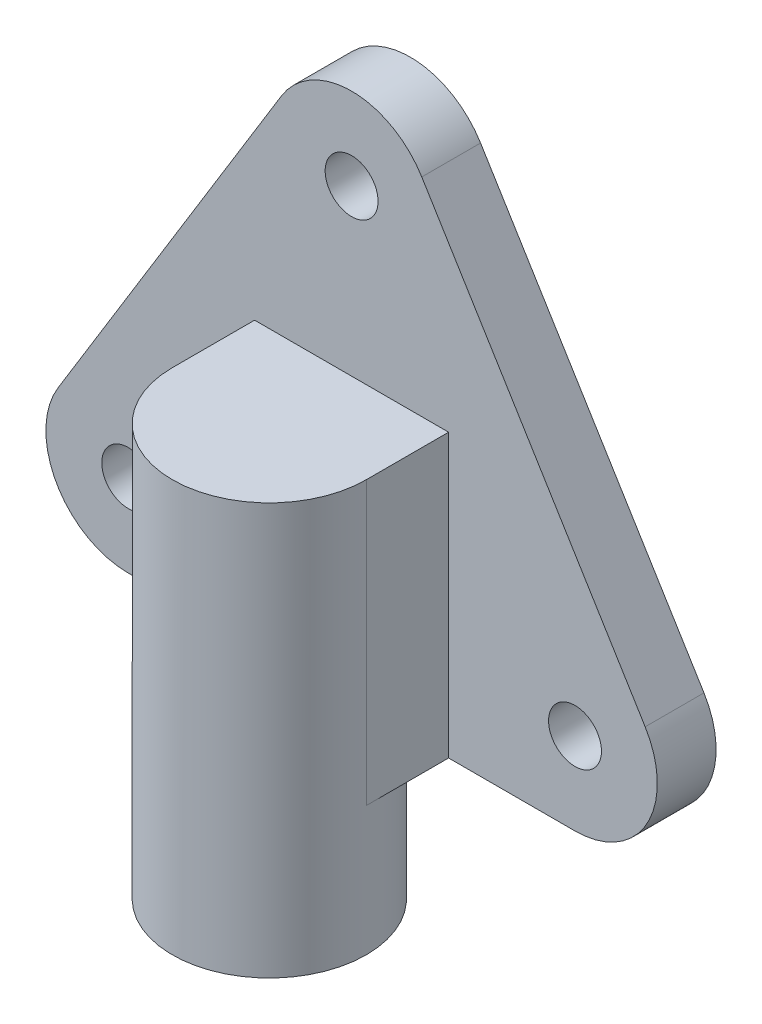
ISO-10303-21;
HEADER;
FILE_DESCRIPTION(('STEP AP214'),'2;1');
FILE_NAME('part.step','',(''),(''),'','','');
FILE_SCHEMA(('AUTOMOTIVE_DESIGN { 1 0 10303 214 1 1 1 1 }'));
ENDSEC;
DATA;
#1=APPLICATION_CONTEXT('core data for automotive mechanical design processes');
#2=APPLICATION_PROTOCOL_DEFINITION('international standard','automotive_design',2000,#1);
#3=PRODUCT_CONTEXT('',#1,'mechanical');
#4=PRODUCT('Part','Part','',(#3));
#5=PRODUCT_RELATED_PRODUCT_CATEGORY('part','',(#4));
#6=PRODUCT_DEFINITION_FORMATION('','',#4);
#7=PRODUCT_DEFINITION_CONTEXT('part definition',#1,'design');
#8=PRODUCT_DEFINITION('design','',#6,#7);
#9=PRODUCT_DEFINITION_SHAPE('','',#8);
#10=(LENGTH_UNIT() NAMED_UNIT(*) SI_UNIT(.MILLI.,.METRE.));
#11=(NAMED_UNIT(*) PLANE_ANGLE_UNIT() SI_UNIT($,.RADIAN.));
#12=(NAMED_UNIT(*) SI_UNIT($,.STERADIAN.) SOLID_ANGLE_UNIT());
#13=UNCERTAINTY_MEASURE_WITH_UNIT(LENGTH_MEASURE(1.E-05),#10,'distance_accuracy_value','');
#14=(GEOMETRIC_REPRESENTATION_CONTEXT(3) GLOBAL_UNCERTAINTY_ASSIGNED_CONTEXT((#13)) GLOBAL_UNIT_ASSIGNED_CONTEXT((#10,
#11,#12)) REPRESENTATION_CONTEXT('',''));
#15=CARTESIAN_POINT('',(0.,0.,0.));
#16=DIRECTION('',(0.,0.,1.));
#17=DIRECTION('',(1.,0.,0.));
#18=AXIS2_PLACEMENT_3D('',#15,#16,#17);
#19=CARTESIAN_POINT('',(0.,62.,10.));
#20=DIRECTION('',(0.,0.,1.));
#21=DIRECTION('',(1.,0.,0.));
#22=AXIS2_PLACEMENT_3D('',#19,#20,#21);
#23=PLANE('',#22);
#24=CARTESIAN_POINT('',(38.,0.,10.));
#25=DIRECTION('',(0.,0.,1.));
#26=DIRECTION('',(1.,0.,0.));
#27=AXIS2_PLACEMENT_3D('',#24,#25,#26);
#28=CIRCLE('',#27,4.5);
#29=CARTESIAN_POINT('',(42.5,0.,10.));
#30=VERTEX_POINT('',#29);
#31=EDGE_CURVE('E179',#30,#30,#28,.T.);
#32=ORIENTED_EDGE('',*,*,#31,.F.);
#33=EDGE_LOOP('',(#32));
#34=FACE_BOUND('',#33,.T.);
#35=CARTESIAN_POINT('',(0.,62.,10.));
#36=DIRECTION('',(0.,0.,1.));
#37=DIRECTION('',(1.,0.,0.));
#38=AXIS2_PLACEMENT_3D('',#35,#36,#37);
#39=CIRCLE('',#38,4.5);
#40=CARTESIAN_POINT('',(4.49999999999999,62.,10.));
#41=VERTEX_POINT('',#40);
#42=EDGE_CURVE('E187',#41,#41,#39,.T.);
#43=ORIENTED_EDGE('',*,*,#42,.F.);
#44=EDGE_LOOP('',(#43));
#45=FACE_BOUND('',#44,.T.);
#46=CARTESIAN_POINT('',(-38.,0.,10.));
#47=DIRECTION('',(0.,0.,1.));
#48=DIRECTION('',(-1.,0.,0.));
#49=AXIS2_PLACEMENT_3D('',#46,#47,#48);
#50=CIRCLE('',#49,4.5);
#51=CARTESIAN_POINT('',(-42.5,0.,10.));
#52=VERTEX_POINT('',#51);
#53=EDGE_CURVE('E171',#52,#52,#50,.T.);
#54=ORIENTED_EDGE('',*,*,#53,.F.);
#55=EDGE_LOOP('',(#54));
#56=FACE_BOUND('',#55,.T.);
#57=DIRECTION('',(1.,0.,0.));
#58=VECTOR('',#57,1.);
#59=CARTESIAN_POINT('',(0.,34.,10.));
#60=LINE('',#59,#58);
#61=CARTESIAN_POINT('',(-16.5,34.,10.));
#62=VERTEX_POINT('',#61);
#63=CARTESIAN_POINT('',(16.5,34.,10.));
#64=VERTEX_POINT('',#63);
#65=EDGE_CURVE('E11',#62,#64,#60,.T.);
#66=ORIENTED_EDGE('',*,*,#65,.T.);
#67=DIRECTION('',(0.,-1.,0.));
#68=VECTOR('',#67,1.);
#69=CARTESIAN_POINT('',(16.5,34.,10.));
#70=LINE('',#69,#68);
#71=CARTESIAN_POINT('',(16.5,-14.,10.));
#72=VERTEX_POINT('',#71);
#73=EDGE_CURVE('E140',#64,#72,#70,.T.);
#74=ORIENTED_EDGE('',*,*,#73,.T.);
#75=DIRECTION('',(1.,0.,0.));
#76=VECTOR('',#75,1.);
#77=CARTESIAN_POINT('',(-38.,-14.,10.));
#78=LINE('',#77,#76);
#79=CARTESIAN_POINT('',(38.,-14.,10.));
#80=VERTEX_POINT('',#79);
#81=EDGE_CURVE('E206',#72,#80,#78,.T.);
#82=ORIENTED_EDGE('',*,*,#81,.T.);
#83=CARTESIAN_POINT('',(38.,0.,10.));
#84=DIRECTION('',(0.,0.,1.));
#85=DIRECTION('',(1.,0.,0.));
#86=AXIS2_PLACEMENT_3D('',#83,#84,#85);
#87=CIRCLE('',#86,14.);
#88=CARTESIAN_POINT('',(49.9364175337532,7.31586881101003,10.));
#89=VERTEX_POINT('',#88);
#90=EDGE_CURVE('E210',#80,#89,#87,.T.);
#91=ORIENTED_EDGE('',*,*,#90,.T.);
#92=DIRECTION('',(-0.522562057929288,0.852601252410943,0.));
#93=VECTOR('',#92,1.);
#94=CARTESIAN_POINT('',(49.9364175337532,7.31586881101003,10.));
#95=LINE('',#94,#93);
#96=CARTESIAN_POINT('',(11.9364175337532,69.31586881101,10.));
#97=VERTEX_POINT('',#96);
#98=EDGE_CURVE('E213',#89,#97,#95,.T.);
#99=ORIENTED_EDGE('',*,*,#98,.T.);
#100=CARTESIAN_POINT('',(0.,62.,10.));
#101=DIRECTION('',(0.,0.,1.));
#102=DIRECTION('',(1.,0.,0.));
#103=AXIS2_PLACEMENT_3D('',#100,#101,#102);
#104=CIRCLE('',#103,14.);
#105=CARTESIAN_POINT('',(-11.9364175337532,69.31586881101,10.));
#106=VERTEX_POINT('',#105);
#107=EDGE_CURVE('E195',#97,#106,#104,.T.);
#108=ORIENTED_EDGE('',*,*,#107,.T.);
#109=DIRECTION('',(-0.522562057929287,-0.852601252410943,0.));
#110=VECTOR('',#109,1.);
#111=CARTESIAN_POINT('',(-49.9364175337532,7.31586881101002,10.));
#112=LINE('',#111,#110);
#113=CARTESIAN_POINT('',(-49.9364175337532,7.31586881101002,10.));
#114=VERTEX_POINT('',#113);
#115=EDGE_CURVE('E199',#106,#114,#112,.T.);
#116=ORIENTED_EDGE('',*,*,#115,.T.);
#117=CARTESIAN_POINT('',(-38.,0.,10.));
#118=DIRECTION('',(0.,0.,1.));
#119=DIRECTION('',(-1.,0.,0.));
#120=AXIS2_PLACEMENT_3D('',#117,#118,#119);
#121=CIRCLE('',#120,14.);
#122=CARTESIAN_POINT('',(-38.,-14.,10.));
#123=VERTEX_POINT('',#122);
#124=EDGE_CURVE('E203',#114,#123,#121,.T.);
#125=ORIENTED_EDGE('',*,*,#124,.T.);
#126=CARTESIAN_POINT('',(-16.5,-14.,10.));
#127=VERTEX_POINT('',#126);
#128=EDGE_CURVE('E207',#123,#127,#78,.T.);
#129=ORIENTED_EDGE('',*,*,#128,.T.);
#130=DIRECTION('',(0.,-1.,0.));
#131=VECTOR('',#130,1.);
#132=CARTESIAN_POINT('',(-16.5,34.,10.));
#133=LINE('',#132,#131);
#134=EDGE_CURVE('E149',#62,#127,#133,.T.);
#135=ORIENTED_EDGE('',*,*,#134,.F.);
#136=EDGE_LOOP('',(#66,#74,#82,#91,#99,#108,#116,#125,#129,#135));
#137=FACE_BOUND('',#136,.T.);
#138=ADVANCED_FACE('F47',(#34,#45,#56,#137),#23,.T.);
#139=CARTESIAN_POINT('',(0.,34.,24.));
#140=DIRECTION('',(0.,-1.,0.));
#141=DIRECTION('',(1.,0.,0.));
#142=AXIS2_PLACEMENT_3D('',#139,#140,#141);
#143=CYLINDRICAL_SURFACE('',#142,16.5);
#144=CARTESIAN_POINT('',(0.,-36.,24.));
#145=DIRECTION('',(0.,-1.,0.));
#146=DIRECTION('',(1.,0.,0.));
#147=AXIS2_PLACEMENT_3D('',#144,#145,#146);
#148=CIRCLE('',#147,16.5);
#149=CARTESIAN_POINT('',(16.5,-36.,24.));
#150=VERTEX_POINT('',#149);
#151=EDGE_CURVE('E131',#150,#150,#148,.T.);
#152=ORIENTED_EDGE('',*,*,#151,.F.);
#153=EDGE_LOOP('',(#152));
#154=FACE_BOUND('',#153,.T.);
#155=CARTESIAN_POINT('',(0.,-14.,24.));
#156=DIRECTION('',(0.,1.,0.));
#157=DIRECTION('',(-1.,0.,0.));
#158=AXIS2_PLACEMENT_3D('',#155,#156,#157);
#159=CIRCLE('',#158,16.5);
#160=CARTESIAN_POINT('',(16.5,-14.,24.));
#161=VERTEX_POINT('',#160);
#162=CARTESIAN_POINT('',(-16.5,-14.,24.));
#163=VERTEX_POINT('',#162);
#164=EDGE_CURVE('E56',#161,#163,#159,.T.);
#165=ORIENTED_EDGE('',*,*,#164,.F.);
#166=DIRECTION('',(0.,-1.,0.));
#167=VECTOR('',#166,1.);
#168=CARTESIAN_POINT('',(16.5,34.,24.));
#169=LINE('',#168,#167);
#170=CARTESIAN_POINT('',(16.5,34.,24.));
#171=VERTEX_POINT('',#170);
#172=EDGE_CURVE('E134',#171,#161,#169,.T.);
#173=ORIENTED_EDGE('',*,*,#172,.F.);
#174=CARTESIAN_POINT('',(0.,34.,24.));
#175=DIRECTION('',(0.,-1.,0.));
#176=DIRECTION('',(1.,0.,0.));
#177=AXIS2_PLACEMENT_3D('',#174,#175,#176);
#178=CIRCLE('',#177,16.5);
#179=CARTESIAN_POINT('',(-16.5,34.,24.));
#180=VERTEX_POINT('',#179);
#181=EDGE_CURVE('E118',#171,#180,#178,.T.);
#182=ORIENTED_EDGE('',*,*,#181,.T.);
#183=DIRECTION('',(0.,-1.,0.));
#184=VECTOR('',#183,1.);
#185=CARTESIAN_POINT('',(-16.5,34.,24.));
#186=LINE('',#185,#184);
#187=EDGE_CURVE('E157',#180,#163,#186,.T.);
#188=ORIENTED_EDGE('',*,*,#187,.T.);
#189=EDGE_LOOP('',(#165,#173,#182,#188));
#190=FACE_BOUND('',#189,.T.);
#191=ADVANCED_FACE('F135',(#154,#190),#143,.T.);
#192=CARTESIAN_POINT('',(0.,62.,0.));
#193=DIRECTION('',(0.,0.,1.));
#194=DIRECTION('',(1.,0.,0.));
#195=AXIS2_PLACEMENT_3D('',#192,#193,#194);
#196=PLANE('',#195);
#197=CARTESIAN_POINT('',(0.,62.,0.));
#198=DIRECTION('',(0.,0.,1.));
#199=DIRECTION('',(1.,0.,0.));
#200=AXIS2_PLACEMENT_3D('',#197,#198,#199);
#201=CIRCLE('',#200,14.);
#202=CARTESIAN_POINT('',(11.9364175337532,69.31586881101,0.));
#203=VERTEX_POINT('',#202);
#204=CARTESIAN_POINT('',(-11.9364175337532,69.31586881101,0.));
#205=VERTEX_POINT('',#204);
#206=EDGE_CURVE('E191',#203,#205,#201,.T.);
#207=ORIENTED_EDGE('',*,*,#206,.F.);
#208=DIRECTION('',(-0.522562057929288,0.852601252410943,0.));
#209=VECTOR('',#208,1.);
#210=CARTESIAN_POINT('',(49.9364175337532,7.31586881101003,0.));
#211=LINE('',#210,#209);
#212=CARTESIAN_POINT('',(49.9364175337532,7.31586881101003,0.));
#213=VERTEX_POINT('',#212);
#214=EDGE_CURVE('E200',#213,#203,#211,.T.);
#215=ORIENTED_EDGE('',*,*,#214,.F.);
#216=CARTESIAN_POINT('',(38.,0.,0.));
#217=DIRECTION('',(0.,0.,1.));
#218=DIRECTION('',(1.,0.,0.));
#219=AXIS2_PLACEMENT_3D('',#216,#217,#218);
#220=CIRCLE('',#219,14.);
#221=CARTESIAN_POINT('',(38.,-14.,0.));
#222=VERTEX_POINT('',#221);
#223=EDGE_CURVE('E229',#222,#213,#220,.T.);
#224=ORIENTED_EDGE('',*,*,#223,.F.);
#225=DIRECTION('',(1.,0.,0.));
#226=VECTOR('',#225,1.);
#227=CARTESIAN_POINT('',(-38.,-14.,0.));
#228=LINE('',#227,#226);
#229=CARTESIAN_POINT('',(-38.,-14.,0.));
#230=VERTEX_POINT('',#229);
#231=EDGE_CURVE('E226',#230,#222,#228,.T.);
#232=ORIENTED_EDGE('',*,*,#231,.F.);
#233=CARTESIAN_POINT('',(-38.,0.,0.));
#234=DIRECTION('',(0.,0.,1.));
#235=DIRECTION('',(-1.,0.,0.));
#236=AXIS2_PLACEMENT_3D('',#233,#234,#235);
#237=CIRCLE('',#236,14.);
#238=CARTESIAN_POINT('',(-49.9364175337532,7.31586881101002,0.));
#239=VERTEX_POINT('',#238);
#240=EDGE_CURVE('E223',#239,#230,#237,.T.);
#241=ORIENTED_EDGE('',*,*,#240,.F.);
#242=DIRECTION('',(-0.522562057929287,-0.852601252410943,0.));
#243=VECTOR('',#242,1.);
#244=CARTESIAN_POINT('',(-49.9364175337532,7.31586881101002,0.));
#245=LINE('',#244,#243);
#246=EDGE_CURVE('E220',#205,#239,#245,.T.);
#247=ORIENTED_EDGE('',*,*,#246,.F.);
#248=EDGE_LOOP('',(#207,#215,#224,#232,#241,#247));
#249=FACE_BOUND('',#248,.T.);
#250=CARTESIAN_POINT('',(0.,62.,0.));
#251=DIRECTION('',(0.,0.,1.));
#252=DIRECTION('',(1.,0.,0.));
#253=AXIS2_PLACEMENT_3D('',#250,#251,#252);
#254=CIRCLE('',#253,4.5);
#255=CARTESIAN_POINT('',(4.49999999999999,62.,0.));
#256=VERTEX_POINT('',#255);
#257=EDGE_CURVE('E183',#256,#256,#254,.T.);
#258=ORIENTED_EDGE('',*,*,#257,.T.);
#259=EDGE_LOOP('',(#258));
#260=FACE_BOUND('',#259,.T.);
#261=CARTESIAN_POINT('',(38.,0.,0.));
#262=DIRECTION('',(0.,0.,1.));
#263=DIRECTION('',(1.,0.,0.));
#264=AXIS2_PLACEMENT_3D('',#261,#262,#263);
#265=CIRCLE('',#264,4.5);
#266=CARTESIAN_POINT('',(42.5,0.,0.));
#267=VERTEX_POINT('',#266);
#268=EDGE_CURVE('E175',#267,#267,#265,.T.);
#269=ORIENTED_EDGE('',*,*,#268,.T.);
#270=EDGE_LOOP('',(#269));
#271=FACE_BOUND('',#270,.T.);
#272=CARTESIAN_POINT('',(-38.,0.,0.));
#273=DIRECTION('',(0.,0.,1.));
#274=DIRECTION('',(-1.,0.,0.));
#275=AXIS2_PLACEMENT_3D('',#272,#273,#274);
#276=CIRCLE('',#275,4.5);
#277=CARTESIAN_POINT('',(-42.5,0.,0.));
#278=VERTEX_POINT('',#277);
#279=EDGE_CURVE('E130',#278,#278,#276,.T.);
#280=ORIENTED_EDGE('',*,*,#279,.T.);
#281=EDGE_LOOP('',(#280));
#282=FACE_BOUND('',#281,.T.);
#283=ADVANCED_FACE('F273',(#249,#260,#271,#282),#196,.F.);
#284=CARTESIAN_POINT('',(0.,62.,10.));
#285=DIRECTION('',(0.,0.,-1.));
#286=DIRECTION('',(-1.,0.,0.));
#287=AXIS2_PLACEMENT_3D('',#284,#285,#286);
#288=CYLINDRICAL_SURFACE('',#287,14.);
#289=ORIENTED_EDGE('',*,*,#206,.T.);
#290=DIRECTION('',(0.,0.,-1.));
#291=VECTOR('',#290,1.);
#292=CARTESIAN_POINT('',(-11.9364175337532,69.31586881101,10.));
#293=LINE('',#292,#291);
#294=EDGE_CURVE('E253',#106,#205,#293,.T.);
#295=ORIENTED_EDGE('',*,*,#294,.F.);
#296=ORIENTED_EDGE('',*,*,#107,.F.);
#297=DIRECTION('',(0.,0.,-1.));
#298=VECTOR('',#297,1.);
#299=CARTESIAN_POINT('',(11.9364175337532,69.31586881101,10.));
#300=LINE('',#299,#298);
#301=EDGE_CURVE('E216',#97,#203,#300,.T.);
#302=ORIENTED_EDGE('',*,*,#301,.T.);
#303=EDGE_LOOP('',(#289,#295,#296,#302));
#304=FACE_BOUND('',#303,.T.);
#305=ADVANCED_FACE('F49',(#304),#288,.T.);
#306=CARTESIAN_POINT('',(-49.9364175337532,7.31586881101002,10.));
#307=DIRECTION('',(0.852601252410943,-0.522562057929287,0.));
#308=DIRECTION('',(0.522562057929287,0.852601252410943,0.));
#309=AXIS2_PLACEMENT_3D('',#306,#307,#308);
#310=PLANE('',#309);
#311=ORIENTED_EDGE('',*,*,#246,.T.);
#312=DIRECTION('',(0.,0.,-1.));
#313=VECTOR('',#312,1.);
#314=CARTESIAN_POINT('',(-49.9364175337532,7.31586881101002,10.));
#315=LINE('',#314,#313);
#316=EDGE_CURVE('E249',#114,#239,#315,.T.);
#317=ORIENTED_EDGE('',*,*,#316,.F.);
#318=ORIENTED_EDGE('',*,*,#115,.F.);
#319=ORIENTED_EDGE('',*,*,#294,.T.);
#320=EDGE_LOOP('',(#311,#317,#318,#319));
#321=FACE_BOUND('',#320,.T.);
#322=ADVANCED_FACE('F290',(#321),#310,.F.);
#323=CARTESIAN_POINT('',(-38.,0.,10.));
#324=DIRECTION('',(0.,0.,-1.));
#325=DIRECTION('',(-1.,0.,0.));
#326=AXIS2_PLACEMENT_3D('',#323,#324,#325);
#327=CYLINDRICAL_SURFACE('',#326,14.);
#328=ORIENTED_EDGE('',*,*,#240,.T.);
#329=DIRECTION('',(0.,0.,-1.));
#330=VECTOR('',#329,1.);
#331=CARTESIAN_POINT('',(-38.,-14.,10.));
#332=LINE('',#331,#330);
#333=EDGE_CURVE('E245',#123,#230,#332,.T.);
#334=ORIENTED_EDGE('',*,*,#333,.F.);
#335=ORIENTED_EDGE('',*,*,#124,.F.);
#336=ORIENTED_EDGE('',*,*,#316,.T.);
#337=EDGE_LOOP('',(#328,#334,#335,#336));
#338=FACE_BOUND('',#337,.T.);
#339=ADVANCED_FACE('F291',(#338),#327,.T.);
#340=CARTESIAN_POINT('',(-38.,-14.,10.));
#341=DIRECTION('',(0.,1.,0.));
#342=DIRECTION('',(-1.,0.,0.));
#343=AXIS2_PLACEMENT_3D('',#340,#341,#342);
#344=PLANE('',#343);
#345=ORIENTED_EDGE('',*,*,#81,.F.);
#346=DIRECTION('',(0.,0.,-1.));
#347=VECTOR('',#346,1.);
#348=CARTESIAN_POINT('',(16.5,-14.,0.));
#349=LINE('',#348,#347);
#350=EDGE_CURVE('E144',#161,#72,#349,.T.);
#351=ORIENTED_EDGE('',*,*,#350,.F.);
#352=ORIENTED_EDGE('',*,*,#164,.T.);
#353=DIRECTION('',(0.,0.,-1.));
#354=VECTOR('',#353,1.);
#355=CARTESIAN_POINT('',(-16.5,-14.,0.));
#356=LINE('',#355,#354);
#357=EDGE_CURVE('E158',#163,#127,#356,.T.);
#358=ORIENTED_EDGE('',*,*,#357,.T.);
#359=ORIENTED_EDGE('',*,*,#128,.F.);
#360=ORIENTED_EDGE('',*,*,#333,.T.);
#361=ORIENTED_EDGE('',*,*,#231,.T.);
#362=DIRECTION('',(0.,0.,-1.));
#363=VECTOR('',#362,1.);
#364=CARTESIAN_POINT('',(38.,-14.,10.));
#365=LINE('',#364,#363);
#366=EDGE_CURVE('E241',#80,#222,#365,.T.);
#367=ORIENTED_EDGE('',*,*,#366,.F.);
#368=EDGE_LOOP('',(#345,#351,#352,#358,#359,#360,#361,#367));
#369=FACE_BOUND('',#368,.T.);
#370=ADVANCED_FACE('F259',(#369),#344,.F.);
#371=CARTESIAN_POINT('',(38.,0.,10.));
#372=DIRECTION('',(0.,0.,-1.));
#373=DIRECTION('',(-1.,0.,0.));
#374=AXIS2_PLACEMENT_3D('',#371,#372,#373);
#375=CYLINDRICAL_SURFACE('',#374,14.);
#376=ORIENTED_EDGE('',*,*,#223,.T.);
#377=DIRECTION('',(0.,0.,-1.));
#378=VECTOR('',#377,1.);
#379=CARTESIAN_POINT('',(49.9364175337532,7.31586881101003,10.));
#380=LINE('',#379,#378);
#381=EDGE_CURVE('E237',#89,#213,#380,.T.);
#382=ORIENTED_EDGE('',*,*,#381,.F.);
#383=ORIENTED_EDGE('',*,*,#90,.F.);
#384=ORIENTED_EDGE('',*,*,#366,.T.);
#385=EDGE_LOOP('',(#376,#382,#383,#384));
#386=FACE_BOUND('',#385,.T.);
#387=ADVANCED_FACE('F278',(#386),#375,.T.);
#388=CARTESIAN_POINT('',(49.9364175337532,7.31586881101003,10.));
#389=DIRECTION('',(-0.852601252410943,-0.522562057929288,0.));
#390=DIRECTION('',(0.522562057929288,-0.852601252410943,0.));
#391=AXIS2_PLACEMENT_3D('',#388,#389,#390);
#392=PLANE('',#391);
#393=ORIENTED_EDGE('',*,*,#214,.T.);
#394=ORIENTED_EDGE('',*,*,#301,.F.);
#395=ORIENTED_EDGE('',*,*,#98,.F.);
#396=ORIENTED_EDGE('',*,*,#381,.T.);
#397=EDGE_LOOP('',(#393,#394,#395,#396));
#398=FACE_BOUND('',#397,.T.);
#399=ADVANCED_FACE('F282',(#398),#392,.F.);
#400=CARTESIAN_POINT('',(0.,62.,10.));
#401=DIRECTION('',(0.,0.,-1.));
#402=DIRECTION('',(-1.,0.,0.));
#403=AXIS2_PLACEMENT_3D('',#400,#401,#402);
#404=CYLINDRICAL_SURFACE('',#403,4.5);
#405=ORIENTED_EDGE('',*,*,#42,.T.);
#406=EDGE_LOOP('',(#405));
#407=FACE_BOUND('',#406,.T.);
#408=ORIENTED_EDGE('',*,*,#257,.F.);
#409=EDGE_LOOP('',(#408));
#410=FACE_BOUND('',#409,.T.);
#411=ADVANCED_FACE('F313',(#407,#410),#404,.F.);
#412=CARTESIAN_POINT('',(38.,0.,10.));
#413=DIRECTION('',(0.,0.,-1.));
#414=DIRECTION('',(-1.,0.,0.));
#415=AXIS2_PLACEMENT_3D('',#412,#413,#414);
#416=CYLINDRICAL_SURFACE('',#415,4.5);
#417=ORIENTED_EDGE('',*,*,#31,.T.);
#418=EDGE_LOOP('',(#417));
#419=FACE_BOUND('',#418,.T.);
#420=ORIENTED_EDGE('',*,*,#268,.F.);
#421=EDGE_LOOP('',(#420));
#422=FACE_BOUND('',#421,.T.);
#423=ADVANCED_FACE('F334',(#419,#422),#416,.F.);
#424=CARTESIAN_POINT('',(-38.,0.,10.));
#425=DIRECTION('',(0.,0.,-1.));
#426=DIRECTION('',(-1.,0.,0.));
#427=AXIS2_PLACEMENT_3D('',#424,#425,#426);
#428=CYLINDRICAL_SURFACE('',#427,4.5);
#429=ORIENTED_EDGE('',*,*,#53,.T.);
#430=EDGE_LOOP('',(#429));
#431=FACE_BOUND('',#430,.T.);
#432=ORIENTED_EDGE('',*,*,#279,.F.);
#433=EDGE_LOOP('',(#432));
#434=FACE_BOUND('',#433,.T.);
#435=ADVANCED_FACE('F341',(#431,#434),#428,.F.);
#436=CARTESIAN_POINT('',(0.,34.,0.));
#437=DIRECTION('',(0.,-1.,0.));
#438=DIRECTION('',(1.,0.,0.));
#439=AXIS2_PLACEMENT_3D('',#436,#437,#438);
#440=PLANE('',#439);
#441=ORIENTED_EDGE('',*,*,#65,.F.);
#442=DIRECTION('',(0.,0.,-1.));
#443=VECTOR('',#442,1.);
#444=CARTESIAN_POINT('',(-16.5,34.,0.));
#445=LINE('',#444,#443);
#446=EDGE_CURVE('E125',#180,#62,#445,.T.);
#447=ORIENTED_EDGE('',*,*,#446,.F.);
#448=ORIENTED_EDGE('',*,*,#181,.F.);
#449=DIRECTION('',(0.,0.,-1.));
#450=VECTOR('',#449,1.);
#451=CARTESIAN_POINT('',(16.5,34.,0.));
#452=LINE('',#451,#450);
#453=EDGE_CURVE('E122',#171,#64,#452,.T.);
#454=ORIENTED_EDGE('',*,*,#453,.T.);
#455=EDGE_LOOP('',(#441,#447,#448,#454));
#456=FACE_BOUND('',#455,.T.);
#457=ADVANCED_FACE('F120',(#456),#440,.F.);
#458=CARTESIAN_POINT('',(0.,-36.,0.));
#459=DIRECTION('',(0.,-1.,0.));
#460=DIRECTION('',(1.,0.,0.));
#461=AXIS2_PLACEMENT_3D('',#458,#459,#460);
#462=PLANE('',#461);
#463=CARTESIAN_POINT('',(0.,-36.,24.));
#464=DIRECTION('',(0.,-1.,0.));
#465=DIRECTION('',(1.,0.,0.));
#466=AXIS2_PLACEMENT_3D('',#463,#464,#465);
#467=CIRCLE('',#466,8.);
#468=CARTESIAN_POINT('',(8.00000000000001,-36.,24.));
#469=VERTEX_POINT('',#468);
#470=EDGE_CURVE('E152',#469,#469,#467,.T.);
#471=ORIENTED_EDGE('',*,*,#470,.F.);
#472=EDGE_LOOP('',(#471));
#473=FACE_BOUND('',#472,.T.);
#474=ORIENTED_EDGE('',*,*,#151,.T.);
#475=EDGE_LOOP('',(#474));
#476=FACE_BOUND('',#475,.T.);
#477=ADVANCED_FACE('F360',(#473,#476),#462,.T.);
#478=CARTESIAN_POINT('',(-16.5,34.,0.));
#479=DIRECTION('',(-1.,0.,0.));
#480=DIRECTION('',(0.,-1.,0.));
#481=AXIS2_PLACEMENT_3D('',#478,#479,#480);
#482=PLANE('',#481);
#483=ORIENTED_EDGE('',*,*,#357,.F.);
#484=ORIENTED_EDGE('',*,*,#187,.F.);
#485=ORIENTED_EDGE('',*,*,#446,.T.);
#486=ORIENTED_EDGE('',*,*,#134,.T.);
#487=EDGE_LOOP('',(#483,#484,#485,#486));
#488=FACE_BOUND('',#487,.T.);
#489=ADVANCED_FACE('F263',(#488),#482,.T.);
#490=CARTESIAN_POINT('',(16.5,34.,0.));
#491=DIRECTION('',(-1.,0.,0.));
#492=DIRECTION('',(0.,-1.,0.));
#493=AXIS2_PLACEMENT_3D('',#490,#491,#492);
#494=PLANE('',#493);
#495=ORIENTED_EDGE('',*,*,#350,.T.);
#496=ORIENTED_EDGE('',*,*,#73,.F.);
#497=ORIENTED_EDGE('',*,*,#453,.F.);
#498=ORIENTED_EDGE('',*,*,#172,.T.);
#499=EDGE_LOOP('',(#495,#496,#497,#498));
#500=FACE_BOUND('',#499,.T.);
#501=ADVANCED_FACE('F142',(#500),#494,.F.);
#502=CARTESIAN_POINT('',(0.,18.,24.));
#503=DIRECTION('',(0.,-1.,0.));
#504=DIRECTION('',(1.,0.,0.));
#505=AXIS2_PLACEMENT_3D('',#502,#503,#504);
#506=CYLINDRICAL_SURFACE('',#505,8.);
#507=CARTESIAN_POINT('',(0.,18.,24.));
#508=DIRECTION('',(0.,-1.,0.));
#509=DIRECTION('',(1.,0.,0.));
#510=AXIS2_PLACEMENT_3D('',#507,#508,#509);
#511=CIRCLE('',#510,8.);
#512=CARTESIAN_POINT('',(8.,18.,24.));
#513=VERTEX_POINT('',#512);
#514=EDGE_CURVE('E162',#513,#513,#511,.T.);
#515=ORIENTED_EDGE('',*,*,#514,.F.);
#516=EDGE_LOOP('',(#515));
#517=FACE_BOUND('',#516,.T.);
#518=ORIENTED_EDGE('',*,*,#470,.T.);
#519=EDGE_LOOP('',(#518));
#520=FACE_BOUND('',#519,.T.);
#521=ADVANCED_FACE('F427',(#517,#520),#506,.F.);
#522=CARTESIAN_POINT('',(0.,18.,24.));
#523=DIRECTION('',(0.,-1.,0.));
#524=DIRECTION('',(1.,0.,0.));
#525=AXIS2_PLACEMENT_3D('',#522,#523,#524);
#526=PLANE('',#525);
#527=ORIENTED_EDGE('',*,*,#514,.T.);
#528=EDGE_LOOP('',(#527));
#529=FACE_BOUND('',#528,.T.);
#530=ADVANCED_FACE('F438',(#529),#526,.T.);
#531=CLOSED_SHELL('',(#138,#191,#283,#305,#322,#339,#370,#387,#399,#411,#423,#435,#457,#477,
#489,#501,#521,#530));
#532=MANIFOLD_SOLID_BREP('B2',#531);
#533=ADVANCED_BREP_SHAPE_REPRESENTATION('',(#18,#532),#14);
#534=SHAPE_DEFINITION_REPRESENTATION(#9,#533);
ENDSEC;
END-ISO-10303-21;
